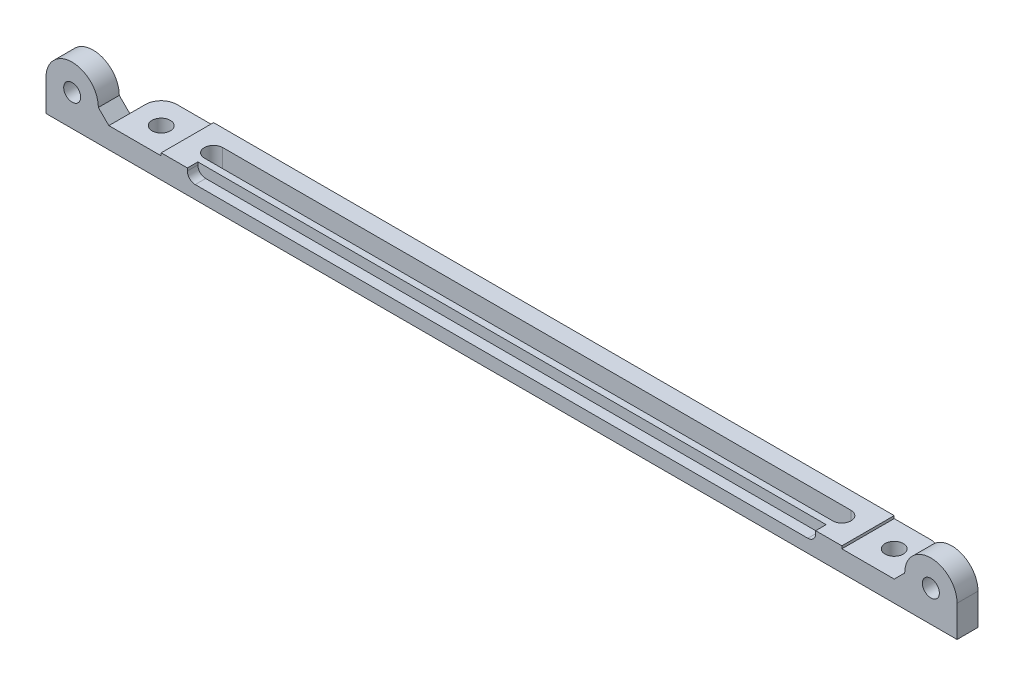
ISO-10303-21;
HEADER;
FILE_DESCRIPTION(('STEP AP214'),'2;1');
FILE_NAME('part.step','',(''),(''),'','','');
FILE_SCHEMA(('AUTOMOTIVE_DESIGN { 1 0 10303 214 1 1 1 1 }'));
ENDSEC;
DATA;
#1=APPLICATION_CONTEXT('core data for automotive mechanical design processes');
#2=APPLICATION_PROTOCOL_DEFINITION('international standard','automotive_design',2000,#1);
#3=PRODUCT_CONTEXT('',#1,'mechanical');
#4=PRODUCT('Part','Part','',(#3));
#5=PRODUCT_RELATED_PRODUCT_CATEGORY('part','',(#4));
#6=PRODUCT_DEFINITION_FORMATION('','',#4);
#7=PRODUCT_DEFINITION_CONTEXT('part definition',#1,'design');
#8=PRODUCT_DEFINITION('design','',#6,#7);
#9=PRODUCT_DEFINITION_SHAPE('','',#8);
#10=(LENGTH_UNIT() NAMED_UNIT(*) SI_UNIT(.MILLI.,.METRE.));
#11=(NAMED_UNIT(*) PLANE_ANGLE_UNIT() SI_UNIT($,.RADIAN.));
#12=(NAMED_UNIT(*) SI_UNIT($,.STERADIAN.) SOLID_ANGLE_UNIT());
#13=UNCERTAINTY_MEASURE_WITH_UNIT(LENGTH_MEASURE(1.E-05),#10,'distance_accuracy_value','');
#14=(GEOMETRIC_REPRESENTATION_CONTEXT(3) GLOBAL_UNCERTAINTY_ASSIGNED_CONTEXT((#13)) GLOBAL_UNIT_ASSIGNED_CONTEXT((#10,
#11,#12)) REPRESENTATION_CONTEXT('',''));
#15=CARTESIAN_POINT('',(0.,0.,0.));
#16=DIRECTION('',(0.,0.,1.));
#17=DIRECTION('',(1.,0.,0.));
#18=AXIS2_PLACEMENT_3D('',#15,#16,#17);
#19=CARTESIAN_POINT('',(74.9999999999999,4.,0.));
#20=DIRECTION('',(1.,0.,0.));
#21=DIRECTION('',(0.,0.,-1.));
#22=AXIS2_PLACEMENT_3D('',#19,#20,#21);
#23=PLANE('',#22);
#24=DIRECTION('',(0.,0.,1.));
#25=VECTOR('',#24,1.);
#26=CARTESIAN_POINT('',(74.9999999999999,4.,0.));
#27=LINE('',#26,#25);
#28=CARTESIAN_POINT('',(74.9999999999999,4.,-1.99999999999999));
#29=VERTEX_POINT('',#28);
#30=CARTESIAN_POINT('',(74.9999999999999,4.,1.));
#31=VERTEX_POINT('',#30);
#32=EDGE_CURVE('E406',#29,#31,#27,.T.);
#33=ORIENTED_EDGE('',*,*,#32,.T.);
#34=DIRECTION('',(0.,1.,0.));
#35=VECTOR('',#34,1.);
#36=CARTESIAN_POINT('',(74.9999999999999,0.,1.));
#37=LINE('',#36,#35);
#38=CARTESIAN_POINT('',(74.9999999999999,0.,1.));
#39=VERTEX_POINT('',#38);
#40=EDGE_CURVE('E225',#39,#31,#37,.T.);
#41=ORIENTED_EDGE('',*,*,#40,.F.);
#42=DIRECTION('',(0.,0.,1.));
#43=VECTOR('',#42,1.);
#44=CARTESIAN_POINT('',(74.9999999999999,0.,0.));
#45=LINE('',#44,#43);
#46=CARTESIAN_POINT('',(74.9999999999999,0.,-1.99999999999999));
#47=VERTEX_POINT('',#46);
#48=EDGE_CURVE('E437',#47,#39,#45,.T.);
#49=ORIENTED_EDGE('',*,*,#48,.F.);
#50=DIRECTION('',(0.,-1.,0.));
#51=VECTOR('',#50,1.);
#52=CARTESIAN_POINT('',(74.9999999999999,4.,-1.99999999999999));
#53=LINE('',#52,#51);
#54=EDGE_CURVE('E444',#29,#47,#53,.T.);
#55=ORIENTED_EDGE('',*,*,#54,.F.);
#56=EDGE_LOOP('',(#33,#41,#49,#55));
#57=FACE_BOUND('',#56,.T.);
#58=ADVANCED_FACE('F35',(#57),#23,.T.);
#59=CARTESIAN_POINT('',(-75.0000000000001,4.,0.));
#60=DIRECTION('',(1.,0.,0.));
#61=DIRECTION('',(0.,0.,-1.));
#62=AXIS2_PLACEMENT_3D('',#59,#60,#61);
#63=PLANE('',#62);
#64=DIRECTION('',(0.,-1.,0.));
#65=VECTOR('',#64,1.);
#66=CARTESIAN_POINT('',(-75.0000000000001,0.,1.));
#67=LINE('',#66,#65);
#68=CARTESIAN_POINT('',(-75.0000000000001,4.,1.));
#69=VERTEX_POINT('',#68);
#70=CARTESIAN_POINT('',(-75.0000000000001,0.,1.));
#71=VERTEX_POINT('',#70);
#72=EDGE_CURVE('E52',#69,#71,#67,.T.);
#73=ORIENTED_EDGE('',*,*,#72,.F.);
#74=DIRECTION('',(0.,0.,1.));
#75=VECTOR('',#74,1.);
#76=CARTESIAN_POINT('',(-75.0000000000001,4.,0.));
#77=LINE('',#76,#75);
#78=CARTESIAN_POINT('',(-75.0000000000001,4.,-1.99999999999997));
#79=VERTEX_POINT('',#78);
#80=EDGE_CURVE('E400',#79,#69,#77,.T.);
#81=ORIENTED_EDGE('',*,*,#80,.F.);
#82=DIRECTION('',(0.,-1.,0.));
#83=VECTOR('',#82,1.);
#84=CARTESIAN_POINT('',(-75.0000000000001,4.,-1.99999999999997));
#85=LINE('',#84,#83);
#86=CARTESIAN_POINT('',(-75.0000000000001,0.,-1.99999999999997));
#87=VERTEX_POINT('',#86);
#88=EDGE_CURVE('E44',#79,#87,#85,.T.);
#89=ORIENTED_EDGE('',*,*,#88,.T.);
#90=DIRECTION('',(0.,0.,1.));
#91=VECTOR('',#90,1.);
#92=CARTESIAN_POINT('',(-75.0000000000001,0.,0.));
#93=LINE('',#92,#91);
#94=EDGE_CURVE('E57',#87,#71,#93,.T.);
#95=ORIENTED_EDGE('',*,*,#94,.T.);
#96=EDGE_LOOP('',(#73,#81,#89,#95));
#97=FACE_BOUND('',#96,.T.);
#98=ADVANCED_FACE('F480',(#97),#63,.F.);
#99=CARTESIAN_POINT('',(0.,4.,0.));
#100=DIRECTION('',(0.,1.,0.));
#101=DIRECTION('',(0.,0.,1.));
#102=AXIS2_PLACEMENT_3D('',#99,#100,#101);
#103=PLANE('',#102);
#104=CARTESIAN_POINT('',(69.9999999999999,4.,0.));
#105=DIRECTION('',(0.,1.,0.));
#106=DIRECTION('',(0.,0.,1.));
#107=AXIS2_PLACEMENT_3D('',#104,#105,#106);
#108=CIRCLE('',#107,1.75);
#109=CARTESIAN_POINT('',(69.9999999999999,4.,1.74999999999999));
#110=VERTEX_POINT('',#109);
#111=EDGE_CURVE('E391',#110,#110,#108,.T.);
#112=ORIENTED_EDGE('',*,*,#111,.F.);
#113=EDGE_LOOP('',(#112));
#114=FACE_BOUND('',#113,.T.);
#115=DIRECTION('',(-1.,0.,0.));
#116=VECTOR('',#115,1.);
#117=CARTESIAN_POINT('',(0.,4.,-5.));
#118=LINE('',#117,#116);
#119=CARTESIAN_POINT('',(71.9999999999999,4.,-5.00000000000001));
#120=VERTEX_POINT('',#119);
#121=CARTESIAN_POINT('',(64.9999999999999,4.,-5.00000000000001));
#122=VERTEX_POINT('',#121);
#123=EDGE_CURVE('E396',#120,#122,#118,.T.);
#124=ORIENTED_EDGE('',*,*,#123,.T.);
#125=DIRECTION('',(0.,0.,1.));
#126=VECTOR('',#125,1.);
#127=CARTESIAN_POINT('',(64.9999999999999,4.,0.));
#128=LINE('',#127,#126);
#129=CARTESIAN_POINT('',(64.9999999999999,4.,4.99999999999999));
#130=VERTEX_POINT('',#129);
#131=EDGE_CURVE('E337',#122,#130,#128,.T.);
#132=ORIENTED_EDGE('',*,*,#131,.T.);
#133=DIRECTION('',(-1.,0.,0.));
#134=VECTOR('',#133,1.);
#135=CARTESIAN_POINT('',(0.,4.,5.));
#136=LINE('',#135,#134);
#137=CARTESIAN_POINT('',(74.9999999999999,4.,5.));
#138=VERTEX_POINT('',#137);
#139=EDGE_CURVE('E403',#138,#130,#136,.T.);
#140=ORIENTED_EDGE('',*,*,#139,.F.);
#141=DIRECTION('',(0.,0.,1.));
#142=VECTOR('',#141,1.);
#143=CARTESIAN_POINT('',(74.9999999999999,4.,1.));
#144=LINE('',#143,#142);
#145=EDGE_CURVE('E237',#31,#138,#144,.T.);
#146=ORIENTED_EDGE('',*,*,#145,.F.);
#147=ORIENTED_EDGE('',*,*,#32,.F.);
#148=CARTESIAN_POINT('',(71.9999999999999,4.,-2.00000000000001));
#149=DIRECTION('',(0.,1.,0.));
#150=DIRECTION('',(0.,0.,1.));
#151=AXIS2_PLACEMENT_3D('',#148,#149,#150);
#152=CIRCLE('',#151,3.);
#153=EDGE_CURVE('E409',#29,#120,#152,.T.);
#154=ORIENTED_EDGE('',*,*,#153,.T.);
#155=EDGE_LOOP('',(#124,#132,#140,#146,#147,#154));
#156=FACE_BOUND('',#155,.T.);
#157=ADVANCED_FACE('F486',(#114,#156),#103,.T.);
#158=CARTESIAN_POINT('',(0.,4.,-5.));
#159=DIRECTION('',(0.,0.,1.));
#160=DIRECTION('',(1.,0.,0.));
#161=AXIS2_PLACEMENT_3D('',#158,#159,#160);
#162=PLANE('',#161);
#163=DIRECTION('',(-1.,0.,0.));
#164=VECTOR('',#163,1.);
#165=CARTESIAN_POINT('',(0.,0.,-5.));
#166=LINE('',#165,#164);
#167=CARTESIAN_POINT('',(71.9999999999999,0.,-5.00000000000001));
#168=VERTEX_POINT('',#167);
#169=CARTESIAN_POINT('',(-72.0000000000001,0.,-4.99999999999999));
#170=VERTEX_POINT('',#169);
#171=EDGE_CURVE('E429',#168,#170,#166,.T.);
#172=ORIENTED_EDGE('',*,*,#171,.T.);
#173=DIRECTION('',(0.,-1.,0.));
#174=VECTOR('',#173,1.);
#175=CARTESIAN_POINT('',(-72.0000000000001,4.,-4.99999999999999));
#176=LINE('',#175,#174);
#177=CARTESIAN_POINT('',(-72.0000000000001,4.,-4.99999999999999));
#178=VERTEX_POINT('',#177);
#179=EDGE_CURVE('E11',#178,#170,#176,.T.);
#180=ORIENTED_EDGE('',*,*,#179,.F.);
#181=CARTESIAN_POINT('',(-65.0000000000001,4.,-4.99999999999999));
#182=VERTEX_POINT('',#181);
#183=EDGE_CURVE('E395',#182,#178,#118,.T.);
#184=ORIENTED_EDGE('',*,*,#183,.F.);
#185=DIRECTION('',(0.,-1.,0.));
#186=VECTOR('',#185,1.);
#187=CARTESIAN_POINT('',(-65.0000000000001,4.5,-4.99999999999999));
#188=LINE('',#187,#186);
#189=CARTESIAN_POINT('',(-65.0000000000001,4.5,-4.99999999999999));
#190=VERTEX_POINT('',#189);
#191=EDGE_CURVE('E381',#190,#182,#188,.T.);
#192=ORIENTED_EDGE('',*,*,#191,.F.);
#193=DIRECTION('',(-1.,0.,0.));
#194=VECTOR('',#193,1.);
#195=CARTESIAN_POINT('',(0.,4.5,-5.));
#196=LINE('',#195,#194);
#197=CARTESIAN_POINT('',(64.9999999999999,4.5,-5.00000000000001));
#198=VERTEX_POINT('',#197);
#199=EDGE_CURVE('E351',#198,#190,#196,.T.);
#200=ORIENTED_EDGE('',*,*,#199,.F.);
#201=DIRECTION('',(0.,-1.,0.));
#202=VECTOR('',#201,1.);
#203=CARTESIAN_POINT('',(64.9999999999999,4.5,-5.00000000000001));
#204=LINE('',#203,#202);
#205=EDGE_CURVE('E384',#198,#122,#204,.T.);
#206=ORIENTED_EDGE('',*,*,#205,.T.);
#207=ORIENTED_EDGE('',*,*,#123,.F.);
#208=DIRECTION('',(0.,-1.,0.));
#209=VECTOR('',#208,1.);
#210=CARTESIAN_POINT('',(71.9999999999999,4.,-5.00000000000001));
#211=LINE('',#210,#209);
#212=EDGE_CURVE('E441',#120,#168,#211,.T.);
#213=ORIENTED_EDGE('',*,*,#212,.T.);
#214=EDGE_LOOP('',(#172,#180,#184,#192,#200,#206,#207,#213));
#215=FACE_BOUND('',#214,.T.);
#216=ADVANCED_FACE('F499',(#215),#162,.F.);
#217=CARTESIAN_POINT('',(-72.0000000000001,4.,-1.99999999999999));
#218=DIRECTION('',(0.,-1.,0.));
#219=DIRECTION('',(0.,0.,-1.));
#220=AXIS2_PLACEMENT_3D('',#217,#218,#219);
#221=CYLINDRICAL_SURFACE('',#220,3.);
#222=CARTESIAN_POINT('',(-72.0000000000001,0.,-1.99999999999999));
#223=DIRECTION('',(0.,1.,0.));
#224=DIRECTION('',(0.,0.,1.));
#225=AXIS2_PLACEMENT_3D('',#222,#223,#224);
#226=CIRCLE('',#225,3.);
#227=EDGE_CURVE('E432',#170,#87,#226,.T.);
#228=ORIENTED_EDGE('',*,*,#227,.T.);
#229=ORIENTED_EDGE('',*,*,#88,.F.);
#230=CARTESIAN_POINT('',(-72.0000000000001,4.,-1.99999999999999));
#231=DIRECTION('',(0.,1.,0.));
#232=DIRECTION('',(0.,0.,1.));
#233=AXIS2_PLACEMENT_3D('',#230,#231,#232);
#234=CIRCLE('',#233,3.);
#235=EDGE_CURVE('E398',#178,#79,#234,.T.);
#236=ORIENTED_EDGE('',*,*,#235,.F.);
#237=ORIENTED_EDGE('',*,*,#179,.T.);
#238=EDGE_LOOP('',(#228,#229,#236,#237));
#239=FACE_BOUND('',#238,.T.);
#240=ADVANCED_FACE('F494',(#239),#221,.T.);
#241=CARTESIAN_POINT('',(0.,4.,5.));
#242=DIRECTION('',(0.,0.,1.));
#243=DIRECTION('',(1.,0.,0.));
#244=AXIS2_PLACEMENT_3D('',#241,#242,#243);
#245=PLANE('',#244);
#246=DIRECTION('',(0.,-1.,0.));
#247=VECTOR('',#246,1.);
#248=CARTESIAN_POINT('',(-59.9999999999999,4.00000000000002,5.));
#249=LINE('',#248,#247);
#250=CARTESIAN_POINT('',(-59.9999999999999,4.5,5.));
#251=VERTEX_POINT('',#250);
#252=CARTESIAN_POINT('',(-59.9999999999999,4.,5.));
#253=VERTEX_POINT('',#252);
#254=EDGE_CURVE('E297',#251,#253,#249,.T.);
#255=ORIENTED_EDGE('',*,*,#254,.F.);
#256=DIRECTION('',(1.,0.,0.));
#257=VECTOR('',#256,1.);
#258=CARTESIAN_POINT('',(0.,4.5,5.));
#259=LINE('',#258,#257);
#260=CARTESIAN_POINT('',(-65.0000000000001,4.5,5.00000000000001));
#261=VERTEX_POINT('',#260);
#262=EDGE_CURVE('E357',#261,#251,#259,.T.);
#263=ORIENTED_EDGE('',*,*,#262,.F.);
#264=DIRECTION('',(0.,-1.,0.));
#265=VECTOR('',#264,1.);
#266=CARTESIAN_POINT('',(-65.0000000000001,4.5,5.00000000000001));
#267=LINE('',#266,#265);
#268=CARTESIAN_POINT('',(-65.0000000000001,4.,5.00000000000001));
#269=VERTEX_POINT('',#268);
#270=EDGE_CURVE('E378',#261,#269,#267,.T.);
#271=ORIENTED_EDGE('',*,*,#270,.T.);
#272=CARTESIAN_POINT('',(-75.0000000000001,4.,5.00000000000001));
#273=VERTEX_POINT('',#272);
#274=EDGE_CURVE('E402',#269,#273,#136,.T.);
#275=ORIENTED_EDGE('',*,*,#274,.T.);
#276=DIRECTION('',(-0.707106781186546,0.707106781186549,0.));
#277=VECTOR('',#276,1.);
#278=CARTESIAN_POINT('',(-35.5000000000002,-35.5,5.));
#279=LINE('',#278,#277);
#280=CARTESIAN_POINT('',(-77.0000000000001,5.99999999999999,5.));
#281=VERTEX_POINT('',#280);
#282=EDGE_CURVE('E287',#273,#281,#279,.T.);
#283=ORIENTED_EDGE('',*,*,#282,.T.);
#284=CARTESIAN_POINT('',(-82.0000000000001,6.,5.));
#285=DIRECTION('',(0.,0.,1.));
#286=DIRECTION('',(1.,0.,0.));
#287=AXIS2_PLACEMENT_3D('',#284,#285,#286);
#288=CIRCLE('',#287,5.);
#289=CARTESIAN_POINT('',(-87.0000000000001,6.,5.));
#290=VERTEX_POINT('',#289);
#291=EDGE_CURVE('E290',#281,#290,#288,.T.);
#292=ORIENTED_EDGE('',*,*,#291,.T.);
#293=DIRECTION('',(0.,1.,0.));
#294=VECTOR('',#293,1.);
#295=CARTESIAN_POINT('',(-87.0000000000001,0.,5.));
#296=LINE('',#295,#294);
#297=CARTESIAN_POINT('',(-87.0000000000001,0.,5.));
#298=VERTEX_POINT('',#297);
#299=EDGE_CURVE('E272',#298,#290,#296,.T.);
#300=ORIENTED_EDGE('',*,*,#299,.F.);
#301=DIRECTION('',(-1.,0.,0.));
#302=VECTOR('',#301,1.);
#303=CARTESIAN_POINT('',(0.,0.,5.));
#304=LINE('',#303,#302);
#305=CARTESIAN_POINT('',(87.0000000000001,1.85037170991441E-12,5.));
#306=VERTEX_POINT('',#305);
#307=EDGE_CURVE('E435',#306,#298,#304,.T.);
#308=ORIENTED_EDGE('',*,*,#307,.F.);
#309=DIRECTION('',(0.,1.,0.));
#310=VECTOR('',#309,1.);
#311=CARTESIAN_POINT('',(87.0000000000001,0.,5.));
#312=LINE('',#311,#310);
#313=CARTESIAN_POINT('',(87.0000000000001,6.00000000000185,5.));
#314=VERTEX_POINT('',#313);
#315=EDGE_CURVE('E246',#306,#314,#312,.T.);
#316=ORIENTED_EDGE('',*,*,#315,.T.);
#317=CARTESIAN_POINT('',(82.,6.00000000000185,5.));
#318=DIRECTION('',(0.,0.,1.));
#319=DIRECTION('',(1.,0.,0.));
#320=AXIS2_PLACEMENT_3D('',#317,#318,#319);
#321=CIRCLE('',#320,5.0000000000001);
#322=CARTESIAN_POINT('',(76.9999999999999,6.00000000000375,5.));
#323=VERTEX_POINT('',#322);
#324=EDGE_CURVE('E257',#323,#314,#321,.F.);
#325=ORIENTED_EDGE('',*,*,#324,.F.);
#326=DIRECTION('',(0.707106781186548,0.707106781186548,0.));
#327=VECTOR('',#326,1.);
#328=CARTESIAN_POINT('',(35.4999999999981,-35.4999999999981,5.));
#329=LINE('',#328,#327);
#330=EDGE_CURVE('E233',#138,#323,#329,.T.);
#331=ORIENTED_EDGE('',*,*,#330,.F.);
#332=ORIENTED_EDGE('',*,*,#139,.T.);
#333=DIRECTION('',(0.,-1.,0.));
#334=VECTOR('',#333,1.);
#335=CARTESIAN_POINT('',(64.9999999999999,4.5,4.99999999999999));
#336=LINE('',#335,#334);
#337=CARTESIAN_POINT('',(64.9999999999999,4.5,4.99999999999999));
#338=VERTEX_POINT('',#337);
#339=EDGE_CURVE('E372',#338,#130,#336,.T.);
#340=ORIENTED_EDGE('',*,*,#339,.F.);
#341=CARTESIAN_POINT('',(60.0000000000001,4.50000000000002,5.));
#342=VERTEX_POINT('',#341);
#343=EDGE_CURVE('E356',#342,#338,#259,.T.);
#344=ORIENTED_EDGE('',*,*,#343,.F.);
#345=DIRECTION('',(0.,1.,0.));
#346=VECTOR('',#345,1.);
#347=CARTESIAN_POINT('',(60.0000000000001,4.00000000000003,5.));
#348=LINE('',#347,#346);
#349=CARTESIAN_POINT('',(60.0000000000001,4.00000000000003,5.));
#350=VERTEX_POINT('',#349);
#351=EDGE_CURVE('E308',#350,#342,#348,.T.);
#352=ORIENTED_EDGE('',*,*,#351,.F.);
#353=CARTESIAN_POINT('',(58.5000000000001,4.00000000000002,5.));
#354=DIRECTION('',(0.,0.,1.));
#355=DIRECTION('',(1.,0.,0.));
#356=AXIS2_PLACEMENT_3D('',#353,#354,#355);
#357=CIRCLE('',#356,1.5);
#358=CARTESIAN_POINT('',(58.5000000000001,2.50000000000002,5.));
#359=VERTEX_POINT('',#358);
#360=EDGE_CURVE('E331',#359,#350,#357,.T.);
#361=ORIENTED_EDGE('',*,*,#360,.F.);
#362=DIRECTION('',(1.,0.,0.));
#363=VECTOR('',#362,1.);
#364=CARTESIAN_POINT('',(58.5000000000001,2.50000000000002,5.));
#365=LINE('',#364,#363);
#366=CARTESIAN_POINT('',(-58.4999999999999,2.5,5.));
#367=VERTEX_POINT('',#366);
#368=EDGE_CURVE('E328',#367,#359,#365,.T.);
#369=ORIENTED_EDGE('',*,*,#368,.F.);
#370=CARTESIAN_POINT('',(-58.4999999999999,4.,5.));
#371=DIRECTION('',(0.,0.,1.));
#372=DIRECTION('',(-1.,0.,0.));
#373=AXIS2_PLACEMENT_3D('',#370,#371,#372);
#374=CIRCLE('',#373,1.5);
#375=EDGE_CURVE('E325',#253,#367,#374,.T.);
#376=ORIENTED_EDGE('',*,*,#375,.F.);
#377=EDGE_LOOP('',(#255,#263,#271,#275,#283,#292,#300,#308,#316,#325,#331,#332,#340,#344,#352,
#361,#369,#376));
#378=FACE_BOUND('',#377,.T.);
#379=CARTESIAN_POINT('',(-82.0000000000001,6.,5.));
#380=DIRECTION('',(0.,0.,1.));
#381=DIRECTION('',(1.,0.,0.));
#382=AXIS2_PLACEMENT_3D('',#379,#380,#381);
#383=CIRCLE('',#382,1.62420519249872);
#384=CARTESIAN_POINT('',(-80.3757948075014,6.,5.));
#385=VERTEX_POINT('',#384);
#386=EDGE_CURVE('E263',#385,#385,#383,.T.);
#387=ORIENTED_EDGE('',*,*,#386,.F.);
#388=EDGE_LOOP('',(#387));
#389=FACE_BOUND('',#388,.T.);
#390=CARTESIAN_POINT('',(82.,6.00000000000185,5.));
#391=DIRECTION('',(0.,0.,1.));
#392=DIRECTION('',(1.,0.,0.));
#393=AXIS2_PLACEMENT_3D('',#390,#391,#392);
#394=CIRCLE('',#393,1.62420519249888);
#395=CARTESIAN_POINT('',(83.6242051924989,6.00000000000185,5.));
#396=VERTEX_POINT('',#395);
#397=EDGE_CURVE('E243',#396,#396,#394,.F.);
#398=ORIENTED_EDGE('',*,*,#397,.T.);
#399=EDGE_LOOP('',(#398));
#400=FACE_BOUND('',#399,.T.);
#401=ADVANCED_FACE('F492',(#378,#389,#400),#245,.T.);
#402=CARTESIAN_POINT('',(59.9999999999999,4.,0.));
#403=DIRECTION('',(0.,-1.,0.));
#404=DIRECTION('',(0.,0.,-1.));
#405=AXIS2_PLACEMENT_3D('',#402,#403,#404);
#406=CYLINDRICAL_SURFACE('',#405,1.75);
#407=CARTESIAN_POINT('',(59.9999999999999,0.,0.));
#408=DIRECTION('',(0.,1.,0.));
#409=DIRECTION('',(0.,0.,1.));
#410=AXIS2_PLACEMENT_3D('',#407,#408,#409);
#411=CIRCLE('',#410,1.75);
#412=CARTESIAN_POINT('',(59.9999999999999,0.,1.74999999999999));
#413=VERTEX_POINT('',#412);
#414=CARTESIAN_POINT('',(59.9999999999999,0.,-1.75000000000001));
#415=VERTEX_POINT('',#414);
#416=EDGE_CURVE('E387',#413,#415,#411,.T.);
#417=ORIENTED_EDGE('',*,*,#416,.F.);
#418=DIRECTION('',(0.,-1.,0.));
#419=VECTOR('',#418,1.);
#420=CARTESIAN_POINT('',(59.9999999999999,4.,1.74999999999999));
#421=LINE('',#420,#419);
#422=CARTESIAN_POINT('',(59.9999999999999,4.5,1.74999999999999));
#423=VERTEX_POINT('',#422);
#424=EDGE_CURVE('E39',#423,#413,#421,.T.);
#425=ORIENTED_EDGE('',*,*,#424,.F.);
#426=CARTESIAN_POINT('',(59.9999999999999,4.5,0.));
#427=DIRECTION('',(0.,1.,0.));
#428=DIRECTION('',(0.,0.,1.));
#429=AXIS2_PLACEMENT_3D('',#426,#427,#428);
#430=CIRCLE('',#429,1.75);
#431=CARTESIAN_POINT('',(59.9999999999999,4.5,-1.75000000000001));
#432=VERTEX_POINT('',#431);
#433=EDGE_CURVE('E363',#432,#423,#430,.F.);
#434=ORIENTED_EDGE('',*,*,#433,.F.);
#435=DIRECTION('',(0.,-1.,0.));
#436=VECTOR('',#435,1.);
#437=CARTESIAN_POINT('',(59.9999999999999,4.,-1.75000000000001));
#438=LINE('',#437,#436);
#439=EDGE_CURVE('E411',#432,#415,#438,.T.);
#440=ORIENTED_EDGE('',*,*,#439,.T.);
#441=EDGE_LOOP('',(#417,#425,#434,#440));
#442=FACE_BOUND('',#441,.T.);
#443=ADVANCED_FACE('F37',(#442),#406,.F.);
#444=CARTESIAN_POINT('',(0.,4.,1.75));
#445=DIRECTION('',(0.,0.,1.));
#446=DIRECTION('',(1.,0.,0.));
#447=AXIS2_PLACEMENT_3D('',#444,#445,#446);
#448=PLANE('',#447);
#449=DIRECTION('',(-1.,0.,0.));
#450=VECTOR('',#449,1.);
#451=CARTESIAN_POINT('',(0.,0.,1.75));
#452=LINE('',#451,#450);
#453=CARTESIAN_POINT('',(-60.0000000000001,0.,1.75));
#454=VERTEX_POINT('',#453);
#455=EDGE_CURVE('E414',#413,#454,#452,.T.);
#456=ORIENTED_EDGE('',*,*,#455,.T.);
#457=DIRECTION('',(0.,-1.,0.));
#458=VECTOR('',#457,1.);
#459=CARTESIAN_POINT('',(-60.0000000000001,4.,1.75));
#460=LINE('',#459,#458);
#461=CARTESIAN_POINT('',(-60.0000000000001,4.5,1.75000000000001));
#462=VERTEX_POINT('',#461);
#463=EDGE_CURVE('E449',#462,#454,#460,.T.);
#464=ORIENTED_EDGE('',*,*,#463,.F.);
#465=DIRECTION('',(-1.,0.,0.));
#466=VECTOR('',#465,1.);
#467=CARTESIAN_POINT('',(0.,4.5,1.75));
#468=LINE('',#467,#466);
#469=EDGE_CURVE('E366',#423,#462,#468,.T.);
#470=ORIENTED_EDGE('',*,*,#469,.F.);
#471=ORIENTED_EDGE('',*,*,#424,.T.);
#472=EDGE_LOOP('',(#456,#464,#470,#471));
#473=FACE_BOUND('',#472,.T.);
#474=ADVANCED_FACE('F456',(#473),#448,.F.);
#475=CARTESIAN_POINT('',(-60.0000000000001,4.,0.));
#476=DIRECTION('',(0.,-1.,0.));
#477=DIRECTION('',(0.,0.,-1.));
#478=AXIS2_PLACEMENT_3D('',#475,#476,#477);
#479=CYLINDRICAL_SURFACE('',#478,1.75);
#480=CARTESIAN_POINT('',(-60.0000000000001,0.,0.));
#481=DIRECTION('',(0.,1.,0.));
#482=DIRECTION('',(0.,0.,1.));
#483=AXIS2_PLACEMENT_3D('',#480,#481,#482);
#484=CIRCLE('',#483,1.75);
#485=CARTESIAN_POINT('',(-60.0000000000001,0.,-1.75));
#486=VERTEX_POINT('',#485);
#487=EDGE_CURVE('E417',#486,#454,#484,.T.);
#488=ORIENTED_EDGE('',*,*,#487,.F.);
#489=DIRECTION('',(0.,-1.,0.));
#490=VECTOR('',#489,1.);
#491=CARTESIAN_POINT('',(-60.0000000000001,4.,-1.75));
#492=LINE('',#491,#490);
#493=CARTESIAN_POINT('',(-60.0000000000001,4.5,-1.75));
#494=VERTEX_POINT('',#493);
#495=EDGE_CURVE('E448',#494,#486,#492,.T.);
#496=ORIENTED_EDGE('',*,*,#495,.F.);
#497=CARTESIAN_POINT('',(-60.0000000000001,4.5,0.));
#498=DIRECTION('',(0.,1.,0.));
#499=DIRECTION('',(0.,0.,1.));
#500=AXIS2_PLACEMENT_3D('',#497,#498,#499);
#501=CIRCLE('',#500,1.75);
#502=EDGE_CURVE('E369',#462,#494,#501,.F.);
#503=ORIENTED_EDGE('',*,*,#502,.F.);
#504=ORIENTED_EDGE('',*,*,#463,.T.);
#505=EDGE_LOOP('',(#488,#496,#503,#504));
#506=FACE_BOUND('',#505,.T.);
#507=ADVANCED_FACE('F467',(#506),#479,.F.);
#508=CARTESIAN_POINT('',(69.9999999999999,4.,0.));
#509=DIRECTION('',(0.,-1.,0.));
#510=DIRECTION('',(0.,0.,-1.));
#511=AXIS2_PLACEMENT_3D('',#508,#509,#510);
#512=CYLINDRICAL_SURFACE('',#511,1.75);
#513=ORIENTED_EDGE('',*,*,#111,.T.);
#514=EDGE_LOOP('',(#513));
#515=FACE_BOUND('',#514,.T.);
#516=CARTESIAN_POINT('',(69.9999999999999,0.,0.));
#517=DIRECTION('',(0.,1.,0.));
#518=DIRECTION('',(0.,0.,1.));
#519=AXIS2_PLACEMENT_3D('',#516,#517,#518);
#520=CIRCLE('',#519,1.75);
#521=CARTESIAN_POINT('',(69.9999999999999,0.,1.74999999999999));
#522=VERTEX_POINT('',#521);
#523=EDGE_CURVE('E426',#522,#522,#520,.T.);
#524=ORIENTED_EDGE('',*,*,#523,.F.);
#525=EDGE_LOOP('',(#524));
#526=FACE_BOUND('',#525,.T.);
#527=ADVANCED_FACE('F469',(#515,#526),#512,.F.);
#528=CARTESIAN_POINT('',(-70.0000000000001,4.,0.));
#529=DIRECTION('',(0.,-1.,0.));
#530=DIRECTION('',(0.,0.,-1.));
#531=AXIS2_PLACEMENT_3D('',#528,#529,#530);
#532=CYLINDRICAL_SURFACE('',#531,1.75);
#533=CARTESIAN_POINT('',(-70.0000000000001,4.,0.));
#534=DIRECTION('',(0.,1.,0.));
#535=DIRECTION('',(0.,0.,1.));
#536=AXIS2_PLACEMENT_3D('',#533,#534,#535);
#537=CIRCLE('',#536,1.75);
#538=CARTESIAN_POINT('',(-70.0000000000001,4.,1.75));
#539=VERTEX_POINT('',#538);
#540=EDGE_CURVE('E388',#539,#539,#537,.T.);
#541=ORIENTED_EDGE('',*,*,#540,.T.);
#542=EDGE_LOOP('',(#541));
#543=FACE_BOUND('',#542,.T.);
#544=CARTESIAN_POINT('',(-70.0000000000001,0.,0.));
#545=DIRECTION('',(0.,1.,0.));
#546=DIRECTION('',(0.,0.,1.));
#547=AXIS2_PLACEMENT_3D('',#544,#545,#546);
#548=CIRCLE('',#547,1.75);
#549=CARTESIAN_POINT('',(-70.0000000000001,0.,1.75));
#550=VERTEX_POINT('',#549);
#551=EDGE_CURVE('E423',#550,#550,#548,.T.);
#552=ORIENTED_EDGE('',*,*,#551,.F.);
#553=EDGE_LOOP('',(#552));
#554=FACE_BOUND('',#553,.T.);
#555=ADVANCED_FACE('F475',(#543,#554),#532,.F.);
#556=CARTESIAN_POINT('',(0.,4.,-1.75));
#557=DIRECTION('',(0.,0.,1.));
#558=DIRECTION('',(1.,0.,0.));
#559=AXIS2_PLACEMENT_3D('',#556,#557,#558);
#560=PLANE('',#559);
#561=DIRECTION('',(-1.,0.,0.));
#562=VECTOR('',#561,1.);
#563=CARTESIAN_POINT('',(0.,0.,-1.75));
#564=LINE('',#563,#562);
#565=EDGE_CURVE('E420',#415,#486,#564,.T.);
#566=ORIENTED_EDGE('',*,*,#565,.F.);
#567=ORIENTED_EDGE('',*,*,#439,.F.);
#568=DIRECTION('',(1.,0.,0.));
#569=VECTOR('',#568,1.);
#570=CARTESIAN_POINT('',(0.,4.5,-1.75));
#571=LINE('',#570,#569);
#572=EDGE_CURVE('E360',#494,#432,#571,.T.);
#573=ORIENTED_EDGE('',*,*,#572,.F.);
#574=ORIENTED_EDGE('',*,*,#495,.T.);
#575=EDGE_LOOP('',(#566,#567,#573,#574));
#576=FACE_BOUND('',#575,.T.);
#577=ADVANCED_FACE('F466',(#576),#560,.T.);
#578=CARTESIAN_POINT('',(71.9999999999999,4.,-2.00000000000001));
#579=DIRECTION('',(0.,-1.,0.));
#580=DIRECTION('',(0.,0.,-1.));
#581=AXIS2_PLACEMENT_3D('',#578,#579,#580);
#582=CYLINDRICAL_SURFACE('',#581,3.);
#583=CARTESIAN_POINT('',(71.9999999999999,0.,-2.00000000000001));
#584=DIRECTION('',(0.,1.,0.));
#585=DIRECTION('',(0.,0.,1.));
#586=AXIS2_PLACEMENT_3D('',#583,#584,#585);
#587=CIRCLE('',#586,3.);
#588=EDGE_CURVE('E392',#47,#168,#587,.T.);
#589=ORIENTED_EDGE('',*,*,#588,.T.);
#590=ORIENTED_EDGE('',*,*,#212,.F.);
#591=ORIENTED_EDGE('',*,*,#153,.F.);
#592=ORIENTED_EDGE('',*,*,#54,.T.);
#593=EDGE_LOOP('',(#589,#590,#591,#592));
#594=FACE_BOUND('',#593,.T.);
#595=ADVANCED_FACE('F490',(#594),#582,.T.);
#596=DIRECTION('',(0.,0.,1.));
#597=VECTOR('',#596,1.);
#598=CARTESIAN_POINT('',(-65.0000000000001,4.,0.));
#599=LINE('',#598,#597);
#600=EDGE_CURVE('E352',#182,#269,#599,.T.);
#601=ORIENTED_EDGE('',*,*,#600,.F.);
#602=ORIENTED_EDGE('',*,*,#183,.T.);
#603=ORIENTED_EDGE('',*,*,#235,.T.);
#604=ORIENTED_EDGE('',*,*,#80,.T.);
#605=DIRECTION('',(0.,0.,1.));
#606=VECTOR('',#605,1.);
#607=CARTESIAN_POINT('',(-75.0000000000001,4.,1.));
#608=LINE('',#607,#606);
#609=EDGE_CURVE('E295',#69,#273,#608,.T.);
#610=ORIENTED_EDGE('',*,*,#609,.T.);
#611=ORIENTED_EDGE('',*,*,#274,.F.);
#612=EDGE_LOOP('',(#601,#602,#603,#604,#610,#611));
#613=FACE_BOUND('',#612,.T.);
#614=ORIENTED_EDGE('',*,*,#540,.F.);
#615=EDGE_LOOP('',(#614));
#616=FACE_BOUND('',#615,.T.);
#617=ADVANCED_FACE('F510',(#613,#616),#103,.T.);
#618=CARTESIAN_POINT('',(0.,0.,0.));
#619=DIRECTION('',(0.,1.,0.));
#620=DIRECTION('',(0.,0.,1.));
#621=AXIS2_PLACEMENT_3D('',#618,#619,#620);
#622=PLANE('',#621);
#623=ORIENTED_EDGE('',*,*,#416,.T.);
#624=ORIENTED_EDGE('',*,*,#565,.T.);
#625=ORIENTED_EDGE('',*,*,#487,.T.);
#626=ORIENTED_EDGE('',*,*,#455,.F.);
#627=EDGE_LOOP('',(#623,#624,#625,#626));
#628=FACE_BOUND('',#627,.T.);
#629=ORIENTED_EDGE('',*,*,#551,.T.);
#630=EDGE_LOOP('',(#629));
#631=FACE_BOUND('',#630,.T.);
#632=ORIENTED_EDGE('',*,*,#523,.T.);
#633=EDGE_LOOP('',(#632));
#634=FACE_BOUND('',#633,.T.);
#635=ORIENTED_EDGE('',*,*,#171,.F.);
#636=ORIENTED_EDGE('',*,*,#588,.F.);
#637=ORIENTED_EDGE('',*,*,#48,.T.);
#638=DIRECTION('',(1.,0.,0.));
#639=VECTOR('',#638,1.);
#640=CARTESIAN_POINT('',(0.,1.8503717077086E-12,1.));
#641=LINE('',#640,#639);
#642=CARTESIAN_POINT('',(87.0000000000001,1.85037170991441E-12,1.));
#643=VERTEX_POINT('',#642);
#644=EDGE_CURVE('E250',#39,#643,#641,.T.);
#645=ORIENTED_EDGE('',*,*,#644,.T.);
#646=DIRECTION('',(0.,0.,1.));
#647=VECTOR('',#646,1.);
#648=CARTESIAN_POINT('',(87.0000000000001,1.85037170991441E-12,1.));
#649=LINE('',#648,#647);
#650=EDGE_CURVE('E264',#643,#306,#649,.T.);
#651=ORIENTED_EDGE('',*,*,#650,.T.);
#652=ORIENTED_EDGE('',*,*,#307,.T.);
#653=DIRECTION('',(0.,0.,1.));
#654=VECTOR('',#653,1.);
#655=CARTESIAN_POINT('',(-87.0000000000001,0.,1.));
#656=LINE('',#655,#654);
#657=CARTESIAN_POINT('',(-87.0000000000001,0.,1.));
#658=VERTEX_POINT('',#657);
#659=EDGE_CURVE('E298',#658,#298,#656,.T.);
#660=ORIENTED_EDGE('',*,*,#659,.F.);
#661=DIRECTION('',(-1.,0.,0.));
#662=VECTOR('',#661,1.);
#663=CARTESIAN_POINT('',(0.,0.,1.));
#664=LINE('',#663,#662);
#665=EDGE_CURVE('E280',#71,#658,#664,.T.);
#666=ORIENTED_EDGE('',*,*,#665,.F.);
#667=ORIENTED_EDGE('',*,*,#94,.F.);
#668=ORIENTED_EDGE('',*,*,#227,.F.);
#669=EDGE_LOOP('',(#635,#636,#637,#645,#651,#652,#660,#666,#667,#668));
#670=FACE_BOUND('',#669,.T.);
#671=ADVANCED_FACE('F461',(#628,#631,#634,#670),#622,.F.);
#672=CARTESIAN_POINT('',(64.9999999999999,4.5,0.));
#673=DIRECTION('',(1.,0.,0.));
#674=DIRECTION('',(0.,0.,-1.));
#675=AXIS2_PLACEMENT_3D('',#672,#673,#674);
#676=PLANE('',#675);
#677=ORIENTED_EDGE('',*,*,#131,.F.);
#678=ORIENTED_EDGE('',*,*,#205,.F.);
#679=DIRECTION('',(0.,0.,1.));
#680=VECTOR('',#679,1.);
#681=CARTESIAN_POINT('',(64.9999999999999,4.5,0.));
#682=LINE('',#681,#680);
#683=EDGE_CURVE('E348',#198,#338,#682,.T.);
#684=ORIENTED_EDGE('',*,*,#683,.T.);
#685=ORIENTED_EDGE('',*,*,#339,.T.);
#686=EDGE_LOOP('',(#677,#678,#684,#685));
#687=FACE_BOUND('',#686,.T.);
#688=ADVANCED_FACE('F542',(#687),#676,.T.);
#689=CARTESIAN_POINT('',(-65.0000000000001,4.5,0.));
#690=DIRECTION('',(1.,0.,0.));
#691=DIRECTION('',(0.,0.,-1.));
#692=AXIS2_PLACEMENT_3D('',#689,#690,#691);
#693=PLANE('',#692);
#694=ORIENTED_EDGE('',*,*,#600,.T.);
#695=ORIENTED_EDGE('',*,*,#270,.F.);
#696=DIRECTION('',(0.,0.,1.));
#697=VECTOR('',#696,1.);
#698=CARTESIAN_POINT('',(-65.0000000000001,4.5,0.));
#699=LINE('',#698,#697);
#700=EDGE_CURVE('E354',#190,#261,#699,.T.);
#701=ORIENTED_EDGE('',*,*,#700,.F.);
#702=ORIENTED_EDGE('',*,*,#191,.T.);
#703=EDGE_LOOP('',(#694,#695,#701,#702));
#704=FACE_BOUND('',#703,.T.);
#705=ADVANCED_FACE('F532',(#704),#693,.F.);
#706=CARTESIAN_POINT('',(0.,4.5,0.));
#707=DIRECTION('',(0.,1.,0.));
#708=DIRECTION('',(0.,0.,1.));
#709=AXIS2_PLACEMENT_3D('',#706,#707,#708);
#710=PLANE('',#709);
#711=DIRECTION('',(0.,0.,1.));
#712=VECTOR('',#711,1.);
#713=CARTESIAN_POINT('',(-59.9999999999999,4.5,3.));
#714=LINE('',#713,#712);
#715=CARTESIAN_POINT('',(-59.9999999999999,4.5,3.));
#716=VERTEX_POINT('',#715);
#717=EDGE_CURVE('E335',#716,#251,#714,.T.);
#718=ORIENTED_EDGE('',*,*,#717,.F.);
#719=DIRECTION('',(-1.,0.,0.));
#720=VECTOR('',#719,1.);
#721=CARTESIAN_POINT('',(60.0000000000001,4.50000000000002,3.));
#722=LINE('',#721,#720);
#723=CARTESIAN_POINT('',(60.0000000000001,4.5,3.));
#724=VERTEX_POINT('',#723);
#725=EDGE_CURVE('E319',#724,#716,#722,.T.);
#726=ORIENTED_EDGE('',*,*,#725,.F.);
#727=DIRECTION('',(0.,0.,1.));
#728=VECTOR('',#727,1.);
#729=CARTESIAN_POINT('',(60.0000000000001,4.50000000000002,3.));
#730=LINE('',#729,#728);
#731=EDGE_CURVE('E338',#724,#342,#730,.T.);
#732=ORIENTED_EDGE('',*,*,#731,.T.);
#733=ORIENTED_EDGE('',*,*,#343,.T.);
#734=ORIENTED_EDGE('',*,*,#683,.F.);
#735=ORIENTED_EDGE('',*,*,#199,.T.);
#736=ORIENTED_EDGE('',*,*,#700,.T.);
#737=ORIENTED_EDGE('',*,*,#262,.T.);
#738=EDGE_LOOP('',(#718,#726,#732,#733,#734,#735,#736,#737));
#739=FACE_BOUND('',#738,.T.);
#740=ORIENTED_EDGE('',*,*,#572,.T.);
#741=ORIENTED_EDGE('',*,*,#433,.T.);
#742=ORIENTED_EDGE('',*,*,#469,.T.);
#743=ORIENTED_EDGE('',*,*,#502,.T.);
#744=EDGE_LOOP('',(#740,#741,#742,#743));
#745=FACE_BOUND('',#744,.T.);
#746=ADVANCED_FACE('F537',(#739,#745),#710,.T.);
#747=CARTESIAN_POINT('',(-59.9999999999999,4.00000000000002,3.));
#748=DIRECTION('',(-1.,0.,0.));
#749=DIRECTION('',(0.,0.,1.));
#750=AXIS2_PLACEMENT_3D('',#747,#748,#749);
#751=PLANE('',#750);
#752=ORIENTED_EDGE('',*,*,#254,.T.);
#753=DIRECTION('',(0.,0.,1.));
#754=VECTOR('',#753,1.);
#755=CARTESIAN_POINT('',(-59.9999999999999,4.,3.));
#756=LINE('',#755,#754);
#757=CARTESIAN_POINT('',(-59.9999999999999,4.,3.));
#758=VERTEX_POINT('',#757);
#759=EDGE_CURVE('E322',#758,#253,#756,.T.);
#760=ORIENTED_EDGE('',*,*,#759,.F.);
#761=DIRECTION('',(0.,-1.,0.));
#762=VECTOR('',#761,1.);
#763=CARTESIAN_POINT('',(-59.9999999999999,4.00000000000002,3.));
#764=LINE('',#763,#762);
#765=EDGE_CURVE('E304',#716,#758,#764,.T.);
#766=ORIENTED_EDGE('',*,*,#765,.F.);
#767=ORIENTED_EDGE('',*,*,#717,.T.);
#768=EDGE_LOOP('',(#752,#760,#766,#767));
#769=FACE_BOUND('',#768,.T.);
#770=ADVANCED_FACE('F572',(#769),#751,.F.);
#771=CARTESIAN_POINT('',(60.0000000000001,4.00000000000003,3.));
#772=DIRECTION('',(1.,0.,0.));
#773=DIRECTION('',(0.,0.,-1.));
#774=AXIS2_PLACEMENT_3D('',#771,#772,#773);
#775=PLANE('',#774);
#776=ORIENTED_EDGE('',*,*,#351,.T.);
#777=ORIENTED_EDGE('',*,*,#731,.F.);
#778=DIRECTION('',(0.,1.,0.));
#779=VECTOR('',#778,1.);
#780=CARTESIAN_POINT('',(60.0000000000001,4.00000000000003,3.));
#781=LINE('',#780,#779);
#782=CARTESIAN_POINT('',(60.0000000000001,4.00000000000003,3.));
#783=VERTEX_POINT('',#782);
#784=EDGE_CURVE('E317',#783,#724,#781,.T.);
#785=ORIENTED_EDGE('',*,*,#784,.F.);
#786=DIRECTION('',(0.,0.,1.));
#787=VECTOR('',#786,1.);
#788=CARTESIAN_POINT('',(60.0000000000001,4.00000000000003,3.));
#789=LINE('',#788,#787);
#790=EDGE_CURVE('E341',#783,#350,#789,.T.);
#791=ORIENTED_EDGE('',*,*,#790,.T.);
#792=EDGE_LOOP('',(#776,#777,#785,#791));
#793=FACE_BOUND('',#792,.T.);
#794=ADVANCED_FACE('F581',(#793),#775,.F.);
#795=CARTESIAN_POINT('',(58.5000000000001,4.00000000000002,3.));
#796=DIRECTION('',(0.,0.,1.));
#797=DIRECTION('',(1.,0.,0.));
#798=AXIS2_PLACEMENT_3D('',#795,#796,#797);
#799=CYLINDRICAL_SURFACE('',#798,1.5);
#800=ORIENTED_EDGE('',*,*,#360,.T.);
#801=ORIENTED_EDGE('',*,*,#790,.F.);
#802=CARTESIAN_POINT('',(58.5000000000001,4.00000000000002,3.));
#803=DIRECTION('',(0.,0.,1.));
#804=DIRECTION('',(1.,0.,0.));
#805=AXIS2_PLACEMENT_3D('',#802,#803,#804);
#806=CIRCLE('',#805,1.5);
#807=CARTESIAN_POINT('',(58.5000000000001,2.50000000000002,3.));
#808=VERTEX_POINT('',#807);
#809=EDGE_CURVE('E314',#808,#783,#806,.T.);
#810=ORIENTED_EDGE('',*,*,#809,.F.);
#811=DIRECTION('',(0.,0.,1.));
#812=VECTOR('',#811,1.);
#813=CARTESIAN_POINT('',(58.5000000000001,2.50000000000002,3.));
#814=LINE('',#813,#812);
#815=EDGE_CURVE('E343',#808,#359,#814,.T.);
#816=ORIENTED_EDGE('',*,*,#815,.T.);
#817=EDGE_LOOP('',(#800,#801,#810,#816));
#818=FACE_BOUND('',#817,.T.);
#819=ADVANCED_FACE('F585',(#818),#799,.F.);
#820=CARTESIAN_POINT('',(58.5000000000001,2.50000000000002,3.));
#821=DIRECTION('',(0.,-1.,0.));
#822=DIRECTION('',(1.,0.,0.));
#823=AXIS2_PLACEMENT_3D('',#820,#821,#822);
#824=PLANE('',#823);
#825=ORIENTED_EDGE('',*,*,#368,.T.);
#826=ORIENTED_EDGE('',*,*,#815,.F.);
#827=DIRECTION('',(1.,0.,0.));
#828=VECTOR('',#827,1.);
#829=CARTESIAN_POINT('',(58.5000000000001,2.50000000000002,3.));
#830=LINE('',#829,#828);
#831=CARTESIAN_POINT('',(-58.4999999999999,2.5,3.));
#832=VERTEX_POINT('',#831);
#833=EDGE_CURVE('E311',#832,#808,#830,.T.);
#834=ORIENTED_EDGE('',*,*,#833,.F.);
#835=DIRECTION('',(0.,0.,1.));
#836=VECTOR('',#835,1.);
#837=CARTESIAN_POINT('',(-58.4999999999999,2.5,3.));
#838=LINE('',#837,#836);
#839=EDGE_CURVE('E345',#832,#367,#838,.T.);
#840=ORIENTED_EDGE('',*,*,#839,.T.);
#841=EDGE_LOOP('',(#825,#826,#834,#840));
#842=FACE_BOUND('',#841,.T.);
#843=ADVANCED_FACE('F588',(#842),#824,.F.);
#844=CARTESIAN_POINT('',(-58.4999999999999,4.,3.));
#845=DIRECTION('',(0.,0.,1.));
#846=DIRECTION('',(1.,0.,0.));
#847=AXIS2_PLACEMENT_3D('',#844,#845,#846);
#848=CYLINDRICAL_SURFACE('',#847,1.5);
#849=ORIENTED_EDGE('',*,*,#375,.T.);
#850=ORIENTED_EDGE('',*,*,#839,.F.);
#851=CARTESIAN_POINT('',(-58.4999999999999,4.,3.));
#852=DIRECTION('',(0.,0.,1.));
#853=DIRECTION('',(-1.,0.,0.));
#854=AXIS2_PLACEMENT_3D('',#851,#852,#853);
#855=CIRCLE('',#854,1.5);
#856=EDGE_CURVE('E307',#758,#832,#855,.T.);
#857=ORIENTED_EDGE('',*,*,#856,.F.);
#858=ORIENTED_EDGE('',*,*,#759,.T.);
#859=EDGE_LOOP('',(#849,#850,#857,#858));
#860=FACE_BOUND('',#859,.T.);
#861=ADVANCED_FACE('F590',(#860),#848,.F.);
#862=CARTESIAN_POINT('',(58.5000000000001,4.00000000000002,3.));
#863=DIRECTION('',(0.,0.,1.));
#864=DIRECTION('',(1.,0.,0.));
#865=AXIS2_PLACEMENT_3D('',#862,#863,#864);
#866=PLANE('',#865);
#867=ORIENTED_EDGE('',*,*,#765,.T.);
#868=ORIENTED_EDGE('',*,*,#856,.T.);
#869=ORIENTED_EDGE('',*,*,#833,.T.);
#870=ORIENTED_EDGE('',*,*,#809,.T.);
#871=ORIENTED_EDGE('',*,*,#784,.T.);
#872=ORIENTED_EDGE('',*,*,#725,.T.);
#873=EDGE_LOOP('',(#867,#868,#869,#870,#871,#872));
#874=FACE_BOUND('',#873,.T.);
#875=ADVANCED_FACE('F577',(#874),#866,.T.);
#876=CARTESIAN_POINT('',(-35.5000000000002,-35.5,1.));
#877=DIRECTION('',(0.707106781186549,0.707106781186546,0.));
#878=DIRECTION('',(-0.707106781186546,0.707106781186549,0.));
#879=AXIS2_PLACEMENT_3D('',#876,#877,#878);
#880=PLANE('',#879);
#881=ORIENTED_EDGE('',*,*,#282,.F.);
#882=ORIENTED_EDGE('',*,*,#609,.F.);
#883=DIRECTION('',(-0.707106781186546,0.707106781186549,0.));
#884=VECTOR('',#883,1.);
#885=CARTESIAN_POINT('',(-35.5000000000002,-35.5,1.));
#886=LINE('',#885,#884);
#887=CARTESIAN_POINT('',(-77.0000000000001,5.99999999999999,1.));
#888=VERTEX_POINT('',#887);
#889=EDGE_CURVE('E271',#69,#888,#886,.T.);
#890=ORIENTED_EDGE('',*,*,#889,.T.);
#891=DIRECTION('',(0.,0.,1.));
#892=VECTOR('',#891,1.);
#893=CARTESIAN_POINT('',(-77.0000000000001,5.99999999999999,1.));
#894=LINE('',#893,#892);
#895=EDGE_CURVE('E284',#888,#281,#894,.T.);
#896=ORIENTED_EDGE('',*,*,#895,.T.);
#897=EDGE_LOOP('',(#881,#882,#890,#896));
#898=FACE_BOUND('',#897,.T.);
#899=ADVANCED_FACE('F566',(#898),#880,.T.);
#900=CARTESIAN_POINT('',(-87.0000000000001,0.,1.));
#901=DIRECTION('',(1.,0.,0.));
#902=DIRECTION('',(0.,0.,-1.));
#903=AXIS2_PLACEMENT_3D('',#900,#901,#902);
#904=PLANE('',#903);
#905=ORIENTED_EDGE('',*,*,#299,.T.);
#906=DIRECTION('',(0.,0.,1.));
#907=VECTOR('',#906,1.);
#908=CARTESIAN_POINT('',(-87.0000000000001,6.,1.));
#909=LINE('',#908,#907);
#910=CARTESIAN_POINT('',(-87.0000000000001,6.,1.));
#911=VERTEX_POINT('',#910);
#912=EDGE_CURVE('E301',#911,#290,#909,.T.);
#913=ORIENTED_EDGE('',*,*,#912,.F.);
#914=DIRECTION('',(0.,1.,0.));
#915=VECTOR('',#914,1.);
#916=CARTESIAN_POINT('',(-87.0000000000001,0.,1.));
#917=LINE('',#916,#915);
#918=EDGE_CURVE('E278',#658,#911,#917,.T.);
#919=ORIENTED_EDGE('',*,*,#918,.F.);
#920=ORIENTED_EDGE('',*,*,#659,.T.);
#921=EDGE_LOOP('',(#905,#913,#919,#920));
#922=FACE_BOUND('',#921,.T.);
#923=ADVANCED_FACE('F558',(#922),#904,.F.);
#924=CARTESIAN_POINT('',(-82.0000000000001,6.,1.));
#925=DIRECTION('',(0.,0.,1.));
#926=DIRECTION('',(1.,0.,0.));
#927=AXIS2_PLACEMENT_3D('',#924,#925,#926);
#928=CYLINDRICAL_SURFACE('',#927,1.62420519249872);
#929=CARTESIAN_POINT('',(-82.0000000000001,6.,1.));
#930=DIRECTION('',(0.,0.,1.));
#931=DIRECTION('',(1.,0.,0.));
#932=AXIS2_PLACEMENT_3D('',#929,#930,#931);
#933=CIRCLE('',#932,1.62420519249872);
#934=CARTESIAN_POINT('',(-80.3757948075014,6.,1.));
#935=VERTEX_POINT('',#934);
#936=EDGE_CURVE('E268',#935,#935,#933,.T.);
#937=ORIENTED_EDGE('',*,*,#936,.F.);
#938=EDGE_LOOP('',(#937));
#939=FACE_BOUND('',#938,.T.);
#940=ORIENTED_EDGE('',*,*,#386,.T.);
#941=EDGE_LOOP('',(#940));
#942=FACE_BOUND('',#941,.T.);
#943=ADVANCED_FACE('F714',(#939,#942),#928,.F.);
#944=CARTESIAN_POINT('',(-82.0000000000001,6.,1.));
#945=DIRECTION('',(0.,0.,1.));
#946=DIRECTION('',(1.,0.,0.));
#947=AXIS2_PLACEMENT_3D('',#944,#945,#946);
#948=CYLINDRICAL_SURFACE('',#947,5.);
#949=ORIENTED_EDGE('',*,*,#291,.F.);
#950=ORIENTED_EDGE('',*,*,#895,.F.);
#951=CARTESIAN_POINT('',(-82.0000000000001,6.,1.));
#952=DIRECTION('',(0.,0.,1.));
#953=DIRECTION('',(1.,0.,0.));
#954=AXIS2_PLACEMENT_3D('',#951,#952,#953);
#955=CIRCLE('',#954,5.);
#956=EDGE_CURVE('E275',#888,#911,#955,.T.);
#957=ORIENTED_EDGE('',*,*,#956,.T.);
#958=ORIENTED_EDGE('',*,*,#912,.T.);
#959=EDGE_LOOP('',(#949,#950,#957,#958));
#960=FACE_BOUND('',#959,.T.);
#961=ADVANCED_FACE('F722',(#960),#948,.T.);
#962=CARTESIAN_POINT('',(0.,0.,1.));
#963=DIRECTION('',(0.,0.,1.));
#964=DIRECTION('',(1.,0.,0.));
#965=AXIS2_PLACEMENT_3D('',#962,#963,#964);
#966=PLANE('',#965);
#967=ORIENTED_EDGE('',*,*,#936,.T.);
#968=EDGE_LOOP('',(#967));
#969=FACE_BOUND('',#968,.T.);
#970=ORIENTED_EDGE('',*,*,#889,.F.);
#971=ORIENTED_EDGE('',*,*,#72,.T.);
#972=ORIENTED_EDGE('',*,*,#665,.T.);
#973=ORIENTED_EDGE('',*,*,#918,.T.);
#974=ORIENTED_EDGE('',*,*,#956,.F.);
#975=EDGE_LOOP('',(#970,#971,#972,#973,#974));
#976=FACE_BOUND('',#975,.T.);
#977=ADVANCED_FACE('F562',(#969,#976),#966,.F.);
#978=CARTESIAN_POINT('',(82.,6.00000000000185,1.));
#979=DIRECTION('',(0.,0.,1.));
#980=DIRECTION('',(1.,0.,0.));
#981=AXIS2_PLACEMENT_3D('',#978,#979,#980);
#982=CYLINDRICAL_SURFACE('',#981,5.0000000000001);
#983=ORIENTED_EDGE('',*,*,#324,.T.);
#984=DIRECTION('',(0.,0.,1.));
#985=VECTOR('',#984,1.);
#986=CARTESIAN_POINT('',(87.0000000000001,6.00000000000185,1.));
#987=LINE('',#986,#985);
#988=CARTESIAN_POINT('',(87.0000000000001,6.00000000000185,1.));
#989=VERTEX_POINT('',#988);
#990=EDGE_CURVE('E241',#989,#314,#987,.T.);
#991=ORIENTED_EDGE('',*,*,#990,.F.);
#992=CARTESIAN_POINT('',(82.,6.00000000000185,1.));
#993=DIRECTION('',(0.,0.,1.));
#994=DIRECTION('',(1.,0.,0.));
#995=AXIS2_PLACEMENT_3D('',#992,#993,#994);
#996=CIRCLE('',#995,5.0000000000001);
#997=CARTESIAN_POINT('',(76.9999999999999,6.00000000000375,1.));
#998=VERTEX_POINT('',#997);
#999=EDGE_CURVE('E222',#998,#989,#996,.F.);
#1000=ORIENTED_EDGE('',*,*,#999,.F.);
#1001=DIRECTION('',(0.,0.,1.));
#1002=VECTOR('',#1001,1.);
#1003=CARTESIAN_POINT('',(76.9999999999999,6.00000000000375,1.));
#1004=LINE('',#1003,#1002);
#1005=EDGE_CURVE('E230',#998,#323,#1004,.T.);
#1006=ORIENTED_EDGE('',*,*,#1005,.T.);
#1007=EDGE_LOOP('',(#983,#991,#1000,#1006));
#1008=FACE_BOUND('',#1007,.T.);
#1009=ADVANCED_FACE('F240',(#1008),#982,.T.);
#1010=CARTESIAN_POINT('',(87.0000000000001,0.,1.));
#1011=DIRECTION('',(1.,0.,0.));
#1012=DIRECTION('',(0.,0.,-1.));
#1013=AXIS2_PLACEMENT_3D('',#1010,#1011,#1012);
#1014=PLANE('',#1013);
#1015=ORIENTED_EDGE('',*,*,#315,.F.);
#1016=ORIENTED_EDGE('',*,*,#650,.F.);
#1017=DIRECTION('',(0.,1.,0.));
#1018=VECTOR('',#1017,1.);
#1019=CARTESIAN_POINT('',(87.0000000000001,0.,1.));
#1020=LINE('',#1019,#1018);
#1021=EDGE_CURVE('E253',#643,#989,#1020,.T.);
#1022=ORIENTED_EDGE('',*,*,#1021,.T.);
#1023=ORIENTED_EDGE('',*,*,#990,.T.);
#1024=EDGE_LOOP('',(#1015,#1016,#1022,#1023));
#1025=FACE_BOUND('',#1024,.T.);
#1026=ADVANCED_FACE('F552',(#1025),#1014,.T.);
#1027=CARTESIAN_POINT('',(35.4999999999981,-35.4999999999981,1.));
#1028=DIRECTION('',(0.707106781186547,-0.707106781186547,0.));
#1029=DIRECTION('',(0.707106781186548,0.707106781186548,0.));
#1030=AXIS2_PLACEMENT_3D('',#1027,#1028,#1029);
#1031=PLANE('',#1030);
#1032=ORIENTED_EDGE('',*,*,#330,.T.);
#1033=ORIENTED_EDGE('',*,*,#1005,.F.);
#1034=DIRECTION('',(0.707106781186548,0.707106781186548,0.));
#1035=VECTOR('',#1034,1.);
#1036=CARTESIAN_POINT('',(35.4999999999981,-35.4999999999981,1.));
#1037=LINE('',#1036,#1035);
#1038=EDGE_CURVE('E216',#31,#998,#1037,.T.);
#1039=ORIENTED_EDGE('',*,*,#1038,.F.);
#1040=ORIENTED_EDGE('',*,*,#145,.T.);
#1041=EDGE_LOOP('',(#1032,#1033,#1039,#1040));
#1042=FACE_BOUND('',#1041,.T.);
#1043=ADVANCED_FACE('F231',(#1042),#1031,.F.);
#1044=CARTESIAN_POINT('',(82.,6.00000000000185,1.));
#1045=DIRECTION('',(0.,0.,1.));
#1046=DIRECTION('',(1.,0.,0.));
#1047=AXIS2_PLACEMENT_3D('',#1044,#1045,#1046);
#1048=CYLINDRICAL_SURFACE('',#1047,1.62420519249888);
#1049=CARTESIAN_POINT('',(82.,6.00000000000185,1.));
#1050=DIRECTION('',(0.,0.,1.));
#1051=DIRECTION('',(1.,0.,0.));
#1052=AXIS2_PLACEMENT_3D('',#1049,#1050,#1051);
#1053=CIRCLE('',#1052,1.62420519249888);
#1054=CARTESIAN_POINT('',(83.6242051924989,6.00000000000185,1.));
#1055=VERTEX_POINT('',#1054);
#1056=EDGE_CURVE('E238',#1055,#1055,#1053,.F.);
#1057=ORIENTED_EDGE('',*,*,#1056,.T.);
#1058=EDGE_LOOP('',(#1057));
#1059=FACE_BOUND('',#1058,.T.);
#1060=ORIENTED_EDGE('',*,*,#397,.F.);
#1061=EDGE_LOOP('',(#1060));
#1062=FACE_BOUND('',#1061,.T.);
#1063=ADVANCED_FACE('F761',(#1059,#1062),#1048,.F.);
#1064=CARTESIAN_POINT('',(0.,0.,1.));
#1065=DIRECTION('',(0.,0.,1.));
#1066=DIRECTION('',(1.,0.,0.));
#1067=AXIS2_PLACEMENT_3D('',#1064,#1065,#1066);
#1068=PLANE('',#1067);
#1069=ORIENTED_EDGE('',*,*,#999,.T.);
#1070=ORIENTED_EDGE('',*,*,#1021,.F.);
#1071=ORIENTED_EDGE('',*,*,#644,.F.);
#1072=ORIENTED_EDGE('',*,*,#40,.T.);
#1073=ORIENTED_EDGE('',*,*,#1038,.T.);
#1074=EDGE_LOOP('',(#1069,#1070,#1071,#1072,#1073));
#1075=FACE_BOUND('',#1074,.T.);
#1076=ORIENTED_EDGE('',*,*,#1056,.F.);
#1077=EDGE_LOOP('',(#1076));
#1078=FACE_BOUND('',#1077,.T.);
#1079=ADVANCED_FACE('F218',(#1075,#1078),#1068,.F.);
#1080=CLOSED_SHELL('',(#58,#98,#157,#216,#240,#401,#443,#474,#507,#527,#555,#577,#595,#617,#671,
#688,#705,#746,#770,#794,#819,#843,#861,#875,#899,#923,#943,#961,#977,#1009,#1026,#1043,#1063,#1079));
#1081=MANIFOLD_SOLID_BREP('B2',#1080);
#1082=ADVANCED_BREP_SHAPE_REPRESENTATION('',(#18,#1081),#14);
#1083=SHAPE_DEFINITION_REPRESENTATION(#9,#1082);
ENDSEC;
END-ISO-10303-21;
